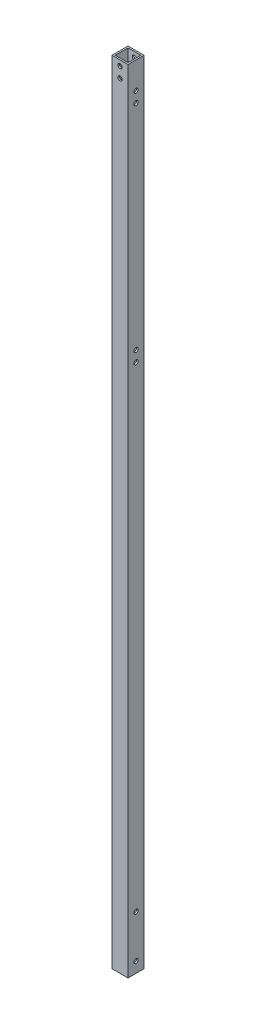
ISO-10303-21;
HEADER;
FILE_DESCRIPTION(('STEP AP214'),'2;1');
FILE_NAME('part.step','',(''),(''),'','','');
FILE_SCHEMA(('AUTOMOTIVE_DESIGN { 1 0 10303 214 1 1 1 1 }'));
ENDSEC;
DATA;
#1=APPLICATION_CONTEXT('core data for automotive mechanical design processes');
#2=APPLICATION_PROTOCOL_DEFINITION('international standard','automotive_design',2000,#1);
#3=PRODUCT_CONTEXT('',#1,'mechanical');
#4=PRODUCT('Part','Part','',(#3));
#5=PRODUCT_RELATED_PRODUCT_CATEGORY('part','',(#4));
#6=PRODUCT_DEFINITION_FORMATION('','',#4);
#7=PRODUCT_DEFINITION_CONTEXT('part definition',#1,'design');
#8=PRODUCT_DEFINITION('design','',#6,#7);
#9=PRODUCT_DEFINITION_SHAPE('','',#8);
#10=(LENGTH_UNIT() NAMED_UNIT(*) SI_UNIT(.MILLI.,.METRE.));
#11=(NAMED_UNIT(*) PLANE_ANGLE_UNIT() SI_UNIT($,.RADIAN.));
#12=(NAMED_UNIT(*) SI_UNIT($,.STERADIAN.) SOLID_ANGLE_UNIT());
#13=UNCERTAINTY_MEASURE_WITH_UNIT(LENGTH_MEASURE(1.E-05),#10,'distance_accuracy_value','');
#14=(GEOMETRIC_REPRESENTATION_CONTEXT(3) GLOBAL_UNCERTAINTY_ASSIGNED_CONTEXT((#13)) GLOBAL_UNIT_ASSIGNED_CONTEXT((#10,
#11,#12)) REPRESENTATION_CONTEXT('',''));
#15=CARTESIAN_POINT('',(0.,0.,0.));
#16=DIRECTION('',(0.,0.,1.));
#17=DIRECTION('',(1.,0.,0.));
#18=AXIS2_PLACEMENT_3D('',#15,#16,#17);
#19=CARTESIAN_POINT('',(0.,740.,0.));
#20=DIRECTION('',(0.,1.,0.));
#21=DIRECTION('',(0.,0.,1.));
#22=AXIS2_PLACEMENT_3D('',#19,#20,#21);
#23=PLANE('',#22);
#24=DIRECTION('',(0.,0.,-1.));
#25=VECTOR('',#24,1.);
#26=CARTESIAN_POINT('',(7.5,740.,-7.5));
#27=LINE('',#26,#25);
#28=CARTESIAN_POINT('',(7.5,740.,7.5));
#29=VERTEX_POINT('',#28);
#30=CARTESIAN_POINT('',(7.5,740.,-7.5));
#31=VERTEX_POINT('',#30);
#32=EDGE_CURVE('E181',#29,#31,#27,.T.);
#33=ORIENTED_EDGE('',*,*,#32,.T.);
#34=DIRECTION('',(-1.,0.,0.));
#35=VECTOR('',#34,1.);
#36=CARTESIAN_POINT('',(-7.5,740.,-7.5));
#37=LINE('',#36,#35);
#38=CARTESIAN_POINT('',(-7.5,740.,-7.5));
#39=VERTEX_POINT('',#38);
#40=EDGE_CURVE('E185',#31,#39,#37,.T.);
#41=ORIENTED_EDGE('',*,*,#40,.T.);
#42=DIRECTION('',(0.,0.,1.));
#43=VECTOR('',#42,1.);
#44=CARTESIAN_POINT('',(-7.5,740.,-7.5));
#45=LINE('',#44,#43);
#46=CARTESIAN_POINT('',(-7.5,740.,7.5));
#47=VERTEX_POINT('',#46);
#48=EDGE_CURVE('E189',#39,#47,#45,.T.);
#49=ORIENTED_EDGE('',*,*,#48,.T.);
#50=DIRECTION('',(1.,0.,0.));
#51=VECTOR('',#50,1.);
#52=CARTESIAN_POINT('',(-7.5,740.,7.5));
#53=LINE('',#52,#51);
#54=EDGE_CURVE('E192',#47,#29,#53,.T.);
#55=ORIENTED_EDGE('',*,*,#54,.T.);
#56=EDGE_LOOP('',(#33,#41,#49,#55));
#57=FACE_BOUND('',#56,.T.);
#58=DIRECTION('',(-1.,0.,0.));
#59=VECTOR('',#58,1.);
#60=CARTESIAN_POINT('',(-7.5,740.,-6.));
#61=LINE('',#60,#59);
#62=CARTESIAN_POINT('',(6.,740.,-6.));
#63=VERTEX_POINT('',#62);
#64=CARTESIAN_POINT('',(-6.,740.,-6.));
#65=VERTEX_POINT('',#64);
#66=EDGE_CURVE('E140',#63,#65,#61,.T.);
#67=ORIENTED_EDGE('',*,*,#66,.F.);
#68=DIRECTION('',(0.,0.,-1.));
#69=VECTOR('',#68,1.);
#70=CARTESIAN_POINT('',(6.,740.,-7.5));
#71=LINE('',#70,#69);
#72=CARTESIAN_POINT('',(6.,740.,6.));
#73=VERTEX_POINT('',#72);
#74=EDGE_CURVE('E131',#73,#63,#71,.T.);
#75=ORIENTED_EDGE('',*,*,#74,.F.);
#76=DIRECTION('',(1.,0.,0.));
#77=VECTOR('',#76,1.);
#78=CARTESIAN_POINT('',(-7.5,740.,6.));
#79=LINE('',#78,#77);
#80=CARTESIAN_POINT('',(-6.,740.,6.));
#81=VERTEX_POINT('',#80);
#82=EDGE_CURVE('E157',#81,#73,#79,.T.);
#83=ORIENTED_EDGE('',*,*,#82,.F.);
#84=DIRECTION('',(0.,0.,1.));
#85=VECTOR('',#84,1.);
#86=CARTESIAN_POINT('',(-6.,740.,-7.5));
#87=LINE('',#86,#85);
#88=EDGE_CURVE('E153',#65,#81,#87,.T.);
#89=ORIENTED_EDGE('',*,*,#88,.F.);
#90=EDGE_LOOP('',(#67,#75,#83,#89));
#91=FACE_BOUND('',#90,.T.);
#92=ADVANCED_FACE('F63',(#57,#91),#23,.T.);
#93=CARTESIAN_POINT('',(0.,0.,0.));
#94=DIRECTION('',(0.,1.,0.));
#95=DIRECTION('',(0.,0.,1.));
#96=AXIS2_PLACEMENT_3D('',#93,#94,#95);
#97=PLANE('',#96);
#98=DIRECTION('',(0.,0.,-1.));
#99=VECTOR('',#98,1.);
#100=CARTESIAN_POINT('',(7.5,0.,-7.5));
#101=LINE('',#100,#99);
#102=CARTESIAN_POINT('',(7.5,0.,7.5));
#103=VERTEX_POINT('',#102);
#104=CARTESIAN_POINT('',(7.5,0.,-7.5));
#105=VERTEX_POINT('',#104);
#106=EDGE_CURVE('E149',#103,#105,#101,.T.);
#107=ORIENTED_EDGE('',*,*,#106,.F.);
#108=DIRECTION('',(1.,0.,0.));
#109=VECTOR('',#108,1.);
#110=CARTESIAN_POINT('',(-7.5,0.,7.5));
#111=LINE('',#110,#109);
#112=CARTESIAN_POINT('',(-7.5,0.,7.5));
#113=VERTEX_POINT('',#112);
#114=EDGE_CURVE('E186',#113,#103,#111,.T.);
#115=ORIENTED_EDGE('',*,*,#114,.F.);
#116=DIRECTION('',(0.,0.,1.));
#117=VECTOR('',#116,1.);
#118=CARTESIAN_POINT('',(-7.5,0.,-7.5));
#119=LINE('',#118,#117);
#120=CARTESIAN_POINT('',(-7.5,0.,-7.5));
#121=VERTEX_POINT('',#120);
#122=EDGE_CURVE('E202',#121,#113,#119,.T.);
#123=ORIENTED_EDGE('',*,*,#122,.F.);
#124=DIRECTION('',(-1.,0.,0.));
#125=VECTOR('',#124,1.);
#126=CARTESIAN_POINT('',(-7.5,0.,-7.5));
#127=LINE('',#126,#125);
#128=EDGE_CURVE('E199',#105,#121,#127,.T.);
#129=ORIENTED_EDGE('',*,*,#128,.F.);
#130=EDGE_LOOP('',(#107,#115,#123,#129));
#131=FACE_BOUND('',#130,.T.);
#132=DIRECTION('',(0.,0.,-1.));
#133=VECTOR('',#132,1.);
#134=CARTESIAN_POINT('',(6.,0.,-7.5));
#135=LINE('',#134,#133);
#136=CARTESIAN_POINT('',(6.,0.,6.));
#137=VERTEX_POINT('',#136);
#138=CARTESIAN_POINT('',(6.,0.,-6.));
#139=VERTEX_POINT('',#138);
#140=EDGE_CURVE('E89',#137,#139,#135,.T.);
#141=ORIENTED_EDGE('',*,*,#140,.T.);
#142=DIRECTION('',(-1.,0.,0.));
#143=VECTOR('',#142,1.);
#144=CARTESIAN_POINT('',(-7.5,0.,-6.));
#145=LINE('',#144,#143);
#146=CARTESIAN_POINT('',(-6.,0.,-6.));
#147=VERTEX_POINT('',#146);
#148=EDGE_CURVE('E147',#139,#147,#145,.T.);
#149=ORIENTED_EDGE('',*,*,#148,.T.);
#150=DIRECTION('',(0.,0.,1.));
#151=VECTOR('',#150,1.);
#152=CARTESIAN_POINT('',(-6.,0.,-7.5));
#153=LINE('',#152,#151);
#154=CARTESIAN_POINT('',(-6.,0.,6.));
#155=VERTEX_POINT('',#154);
#156=EDGE_CURVE('E168',#147,#155,#153,.T.);
#157=ORIENTED_EDGE('',*,*,#156,.T.);
#158=DIRECTION('',(1.,0.,0.));
#159=VECTOR('',#158,1.);
#160=CARTESIAN_POINT('',(-7.5,0.,6.));
#161=LINE('',#160,#159);
#162=EDGE_CURVE('E141',#155,#137,#161,.T.);
#163=ORIENTED_EDGE('',*,*,#162,.T.);
#164=EDGE_LOOP('',(#141,#149,#157,#163));
#165=FACE_BOUND('',#164,.T.);
#166=ADVANCED_FACE('F372',(#131,#165),#97,.F.);
#167=CARTESIAN_POINT('',(7.5,740.,-7.5));
#168=DIRECTION('',(-1.,0.,0.));
#169=DIRECTION('',(0.,0.,1.));
#170=AXIS2_PLACEMENT_3D('',#167,#168,#169);
#171=PLANE('',#170);
#172=CARTESIAN_POINT('',(7.5,505.,0.));
#173=DIRECTION('',(1.,0.,0.));
#174=DIRECTION('',(0.,0.,-1.));
#175=AXIS2_PLACEMENT_3D('',#172,#173,#174);
#176=CIRCLE('',#175,2.);
#177=CARTESIAN_POINT('',(7.5,505.,-2.));
#178=VERTEX_POINT('',#177);
#179=EDGE_CURVE('E283',#178,#178,#176,.T.);
#180=ORIENTED_EDGE('',*,*,#179,.F.);
#181=EDGE_LOOP('',(#180));
#182=FACE_BOUND('',#181,.T.);
#183=CARTESIAN_POINT('',(7.5,705.,0.));
#184=DIRECTION('',(1.,0.,0.));
#185=DIRECTION('',(0.,0.,-1.));
#186=AXIS2_PLACEMENT_3D('',#183,#184,#185);
#187=CIRCLE('',#186,2.);
#188=CARTESIAN_POINT('',(7.5,705.,-2.00000000000001));
#189=VERTEX_POINT('',#188);
#190=EDGE_CURVE('E292',#189,#189,#187,.T.);
#191=ORIENTED_EDGE('',*,*,#190,.F.);
#192=EDGE_LOOP('',(#191));
#193=FACE_BOUND('',#192,.T.);
#194=CARTESIAN_POINT('',(7.5,715.,0.));
#195=DIRECTION('',(1.,0.,0.));
#196=DIRECTION('',(0.,0.,-1.));
#197=AXIS2_PLACEMENT_3D('',#194,#195,#196);
#198=CIRCLE('',#197,2.);
#199=CARTESIAN_POINT('',(7.5,715.,-2.));
#200=VERTEX_POINT('',#199);
#201=EDGE_CURVE('E291',#200,#200,#198,.T.);
#202=ORIENTED_EDGE('',*,*,#201,.F.);
#203=EDGE_LOOP('',(#202));
#204=FACE_BOUND('',#203,.T.);
#205=CARTESIAN_POINT('',(7.5,10.,0.));
#206=DIRECTION('',(1.,0.,0.));
#207=DIRECTION('',(0.,0.,-1.));
#208=AXIS2_PLACEMENT_3D('',#205,#206,#207);
#209=CIRCLE('',#208,2.);
#210=CARTESIAN_POINT('',(7.5,10.,-2.));
#211=VERTEX_POINT('',#210);
#212=EDGE_CURVE('E308',#211,#211,#209,.T.);
#213=ORIENTED_EDGE('',*,*,#212,.F.);
#214=EDGE_LOOP('',(#213));
#215=FACE_BOUND('',#214,.T.);
#216=CARTESIAN_POINT('',(7.5,495.,0.));
#217=DIRECTION('',(1.,0.,0.));
#218=DIRECTION('',(0.,0.,-1.));
#219=AXIS2_PLACEMENT_3D('',#216,#217,#218);
#220=CIRCLE('',#219,2.);
#221=CARTESIAN_POINT('',(7.5,495.,-2.));
#222=VERTEX_POINT('',#221);
#223=EDGE_CURVE('E278',#222,#222,#220,.T.);
#224=ORIENTED_EDGE('',*,*,#223,.F.);
#225=EDGE_LOOP('',(#224));
#226=FACE_BOUND('',#225,.T.);
#227=CARTESIAN_POINT('',(7.5,50.,0.));
#228=DIRECTION('',(1.,0.,0.));
#229=DIRECTION('',(0.,0.,-1.));
#230=AXIS2_PLACEMENT_3D('',#227,#228,#229);
#231=CIRCLE('',#230,2.);
#232=CARTESIAN_POINT('',(7.5,50.,-2.));
#233=VERTEX_POINT('',#232);
#234=EDGE_CURVE('E307',#233,#233,#231,.T.);
#235=ORIENTED_EDGE('',*,*,#234,.F.);
#236=EDGE_LOOP('',(#235));
#237=FACE_BOUND('',#236,.T.);
#238=ORIENTED_EDGE('',*,*,#106,.T.);
#239=DIRECTION('',(0.,-1.,0.));
#240=VECTOR('',#239,1.);
#241=CARTESIAN_POINT('',(7.5,740.,-7.5));
#242=LINE('',#241,#240);
#243=EDGE_CURVE('E12',#31,#105,#242,.T.);
#244=ORIENTED_EDGE('',*,*,#243,.F.);
#245=ORIENTED_EDGE('',*,*,#32,.F.);
#246=DIRECTION('',(0.,-1.,0.));
#247=VECTOR('',#246,1.);
#248=CARTESIAN_POINT('',(7.5,740.,7.5));
#249=LINE('',#248,#247);
#250=EDGE_CURVE('E195',#29,#103,#249,.T.);
#251=ORIENTED_EDGE('',*,*,#250,.T.);
#252=EDGE_LOOP('',(#238,#244,#245,#251));
#253=FACE_BOUND('',#252,.T.);
#254=ADVANCED_FACE('F65',(#182,#193,#204,#215,#226,#237,#253),#171,.F.);
#255=CARTESIAN_POINT('',(-7.5,740.,-7.5));
#256=DIRECTION('',(0.,0.,1.));
#257=DIRECTION('',(1.,0.,0.));
#258=AXIS2_PLACEMENT_3D('',#255,#256,#257);
#259=PLANE('',#258);
#260=CARTESIAN_POINT('',(0.,735.,-7.5));
#261=DIRECTION('',(0.,0.,1.));
#262=DIRECTION('',(1.,0.,0.));
#263=AXIS2_PLACEMENT_3D('',#260,#261,#262);
#264=CIRCLE('',#263,2.);
#265=CARTESIAN_POINT('',(2.,735.,-7.5));
#266=VERTEX_POINT('',#265);
#267=EDGE_CURVE('E250',#266,#266,#264,.T.);
#268=ORIENTED_EDGE('',*,*,#267,.T.);
#269=EDGE_LOOP('',(#268));
#270=FACE_BOUND('',#269,.T.);
#271=CARTESIAN_POINT('',(0.,725.,-7.5));
#272=DIRECTION('',(0.,0.,1.));
#273=DIRECTION('',(1.,0.,0.));
#274=AXIS2_PLACEMENT_3D('',#271,#272,#273);
#275=CIRCLE('',#274,2.);
#276=CARTESIAN_POINT('',(2.,725.,-7.5));
#277=VERTEX_POINT('',#276);
#278=EDGE_CURVE('E264',#277,#277,#275,.T.);
#279=ORIENTED_EDGE('',*,*,#278,.T.);
#280=EDGE_LOOP('',(#279));
#281=FACE_BOUND('',#280,.T.);
#282=ORIENTED_EDGE('',*,*,#128,.T.);
#283=DIRECTION('',(0.,-1.,0.));
#284=VECTOR('',#283,1.);
#285=CARTESIAN_POINT('',(-7.5,740.,-7.5));
#286=LINE('',#285,#284);
#287=EDGE_CURVE('E73',#39,#121,#286,.T.);
#288=ORIENTED_EDGE('',*,*,#287,.F.);
#289=ORIENTED_EDGE('',*,*,#40,.F.);
#290=ORIENTED_EDGE('',*,*,#243,.T.);
#291=EDGE_LOOP('',(#282,#288,#289,#290));
#292=FACE_BOUND('',#291,.T.);
#293=ADVANCED_FACE('F371',(#270,#281,#292),#259,.F.);
#294=CARTESIAN_POINT('',(-7.5,740.,-7.5));
#295=DIRECTION('',(1.,0.,0.));
#296=DIRECTION('',(0.,0.,-1.));
#297=AXIS2_PLACEMENT_3D('',#294,#295,#296);
#298=PLANE('',#297);
#299=CARTESIAN_POINT('',(-7.50000000000001,505.,0.));
#300=DIRECTION('',(1.,0.,0.));
#301=DIRECTION('',(0.,0.,-1.));
#302=AXIS2_PLACEMENT_3D('',#299,#300,#301);
#303=CIRCLE('',#302,2.);
#304=CARTESIAN_POINT('',(-7.50000000000001,505.,-2.));
#305=VERTEX_POINT('',#304);
#306=EDGE_CURVE('E296',#305,#305,#303,.T.);
#307=ORIENTED_EDGE('',*,*,#306,.T.);
#308=EDGE_LOOP('',(#307));
#309=FACE_BOUND('',#308,.T.);
#310=CARTESIAN_POINT('',(-7.50000000000001,705.,0.));
#311=DIRECTION('',(1.,0.,0.));
#312=DIRECTION('',(0.,0.,-1.));
#313=AXIS2_PLACEMENT_3D('',#310,#311,#312);
#314=CIRCLE('',#313,2.);
#315=CARTESIAN_POINT('',(-7.50000000000001,705.,-2.));
#316=VERTEX_POINT('',#315);
#317=EDGE_CURVE('E287',#316,#316,#314,.T.);
#318=ORIENTED_EDGE('',*,*,#317,.T.);
#319=EDGE_LOOP('',(#318));
#320=FACE_BOUND('',#319,.T.);
#321=CARTESIAN_POINT('',(-7.50000000000001,715.,0.));
#322=DIRECTION('',(1.,0.,0.));
#323=DIRECTION('',(0.,0.,-1.));
#324=AXIS2_PLACEMENT_3D('',#321,#322,#323);
#325=CIRCLE('',#324,2.);
#326=CARTESIAN_POINT('',(-7.50000000000001,715.,-2.));
#327=VERTEX_POINT('',#326);
#328=EDGE_CURVE('E312',#327,#327,#325,.T.);
#329=ORIENTED_EDGE('',*,*,#328,.T.);
#330=EDGE_LOOP('',(#329));
#331=FACE_BOUND('',#330,.T.);
#332=CARTESIAN_POINT('',(-7.50000000000001,10.,0.));
#333=DIRECTION('',(1.,0.,0.));
#334=DIRECTION('',(0.,0.,-1.));
#335=AXIS2_PLACEMENT_3D('',#332,#333,#334);
#336=CIRCLE('',#335,2.);
#337=CARTESIAN_POINT('',(-7.50000000000001,10.,-2.));
#338=VERTEX_POINT('',#337);
#339=EDGE_CURVE('E303',#338,#338,#336,.T.);
#340=ORIENTED_EDGE('',*,*,#339,.T.);
#341=EDGE_LOOP('',(#340));
#342=FACE_BOUND('',#341,.T.);
#343=CARTESIAN_POINT('',(-7.50000000000001,495.,0.));
#344=DIRECTION('',(1.,0.,0.));
#345=DIRECTION('',(0.,0.,-1.));
#346=AXIS2_PLACEMENT_3D('',#343,#344,#345);
#347=CIRCLE('',#346,2.);
#348=CARTESIAN_POINT('',(-7.50000000000001,495.,-2.));
#349=VERTEX_POINT('',#348);
#350=EDGE_CURVE('E279',#349,#349,#347,.T.);
#351=ORIENTED_EDGE('',*,*,#350,.T.);
#352=EDGE_LOOP('',(#351));
#353=FACE_BOUND('',#352,.T.);
#354=CARTESIAN_POINT('',(-7.50000000000001,50.,0.));
#355=DIRECTION('',(1.,0.,0.));
#356=DIRECTION('',(0.,0.,-1.));
#357=AXIS2_PLACEMENT_3D('',#354,#355,#356);
#358=CIRCLE('',#357,2.);
#359=CARTESIAN_POINT('',(-7.50000000000001,50.,-2.));
#360=VERTEX_POINT('',#359);
#361=EDGE_CURVE('E222',#360,#360,#358,.T.);
#362=ORIENTED_EDGE('',*,*,#361,.T.);
#363=EDGE_LOOP('',(#362));
#364=FACE_BOUND('',#363,.T.);
#365=ORIENTED_EDGE('',*,*,#122,.T.);
#366=DIRECTION('',(0.,-1.,0.));
#367=VECTOR('',#366,1.);
#368=CARTESIAN_POINT('',(-7.5,740.,7.5));
#369=LINE('',#368,#367);
#370=EDGE_CURVE('E210',#47,#113,#369,.T.);
#371=ORIENTED_EDGE('',*,*,#370,.F.);
#372=ORIENTED_EDGE('',*,*,#48,.F.);
#373=ORIENTED_EDGE('',*,*,#287,.T.);
#374=EDGE_LOOP('',(#365,#371,#372,#373));
#375=FACE_BOUND('',#374,.T.);
#376=ADVANCED_FACE('F390',(#309,#320,#331,#342,#353,#364,#375),#298,.F.);
#377=CARTESIAN_POINT('',(-7.5,740.,7.5));
#378=DIRECTION('',(0.,0.,-1.));
#379=DIRECTION('',(-1.,0.,0.));
#380=AXIS2_PLACEMENT_3D('',#377,#378,#379);
#381=PLANE('',#380);
#382=CARTESIAN_POINT('',(0.,735.,7.5));
#383=DIRECTION('',(0.,0.,1.));
#384=DIRECTION('',(1.,0.,0.));
#385=AXIS2_PLACEMENT_3D('',#382,#383,#384);
#386=CIRCLE('',#385,2.);
#387=CARTESIAN_POINT('',(2.,735.,7.5));
#388=VERTEX_POINT('',#387);
#389=EDGE_CURVE('E258',#388,#388,#386,.T.);
#390=ORIENTED_EDGE('',*,*,#389,.F.);
#391=EDGE_LOOP('',(#390));
#392=FACE_BOUND('',#391,.T.);
#393=CARTESIAN_POINT('',(0.,725.,7.5));
#394=DIRECTION('',(0.,0.,1.));
#395=DIRECTION('',(1.,0.,0.));
#396=AXIS2_PLACEMENT_3D('',#393,#394,#395);
#397=CIRCLE('',#396,2.);
#398=CARTESIAN_POINT('',(2.,725.,7.5));
#399=VERTEX_POINT('',#398);
#400=EDGE_CURVE('E270',#399,#399,#397,.T.);
#401=ORIENTED_EDGE('',*,*,#400,.F.);
#402=EDGE_LOOP('',(#401));
#403=FACE_BOUND('',#402,.T.);
#404=ORIENTED_EDGE('',*,*,#114,.T.);
#405=ORIENTED_EDGE('',*,*,#250,.F.);
#406=ORIENTED_EDGE('',*,*,#54,.F.);
#407=ORIENTED_EDGE('',*,*,#370,.T.);
#408=EDGE_LOOP('',(#404,#405,#406,#407));
#409=FACE_BOUND('',#408,.T.);
#410=ADVANCED_FACE('F348',(#392,#403,#409),#381,.F.);
#411=CARTESIAN_POINT('',(6.,740.,-7.5));
#412=DIRECTION('',(-1.,0.,0.));
#413=DIRECTION('',(0.,0.,1.));
#414=AXIS2_PLACEMENT_3D('',#411,#412,#413);
#415=PLANE('',#414);
#416=CARTESIAN_POINT('',(6.,505.,0.));
#417=DIRECTION('',(-1.,0.,0.));
#418=DIRECTION('',(0.,0.,1.));
#419=AXIS2_PLACEMENT_3D('',#416,#417,#418);
#420=CIRCLE('',#419,2.);
#421=CARTESIAN_POINT('',(6.,505.,2.));
#422=VERTEX_POINT('',#421);
#423=EDGE_CURVE('E165',#422,#422,#420,.T.);
#424=ORIENTED_EDGE('',*,*,#423,.F.);
#425=EDGE_LOOP('',(#424));
#426=FACE_BOUND('',#425,.T.);
#427=CARTESIAN_POINT('',(6.,705.,0.));
#428=DIRECTION('',(-1.,0.,0.));
#429=DIRECTION('',(0.,0.,1.));
#430=AXIS2_PLACEMENT_3D('',#427,#428,#429);
#431=CIRCLE('',#430,2.);
#432=CARTESIAN_POINT('',(6.,705.,2.));
#433=VERTEX_POINT('',#432);
#434=EDGE_CURVE('E242',#433,#433,#431,.T.);
#435=ORIENTED_EDGE('',*,*,#434,.F.);
#436=EDGE_LOOP('',(#435));
#437=FACE_BOUND('',#436,.T.);
#438=CARTESIAN_POINT('',(6.,715.,0.));
#439=DIRECTION('',(-1.,0.,0.));
#440=DIRECTION('',(0.,0.,1.));
#441=AXIS2_PLACEMENT_3D('',#438,#439,#440);
#442=CIRCLE('',#441,2.);
#443=CARTESIAN_POINT('',(6.,715.,2.));
#444=VERTEX_POINT('',#443);
#445=EDGE_CURVE('E237',#444,#444,#442,.T.);
#446=ORIENTED_EDGE('',*,*,#445,.F.);
#447=EDGE_LOOP('',(#446));
#448=FACE_BOUND('',#447,.T.);
#449=CARTESIAN_POINT('',(6.,10.,0.));
#450=DIRECTION('',(-1.,0.,0.));
#451=DIRECTION('',(0.,0.,1.));
#452=AXIS2_PLACEMENT_3D('',#449,#450,#451);
#453=CIRCLE('',#452,2.);
#454=CARTESIAN_POINT('',(6.,10.,2.));
#455=VERTEX_POINT('',#454);
#456=EDGE_CURVE('E232',#455,#455,#453,.T.);
#457=ORIENTED_EDGE('',*,*,#456,.F.);
#458=EDGE_LOOP('',(#457));
#459=FACE_BOUND('',#458,.T.);
#460=CARTESIAN_POINT('',(6.,495.,0.));
#461=DIRECTION('',(-1.,0.,0.));
#462=DIRECTION('',(0.,0.,1.));
#463=AXIS2_PLACEMENT_3D('',#460,#461,#462);
#464=CIRCLE('',#463,2.);
#465=CARTESIAN_POINT('',(6.,495.,2.));
#466=VERTEX_POINT('',#465);
#467=EDGE_CURVE('E227',#466,#466,#464,.T.);
#468=ORIENTED_EDGE('',*,*,#467,.F.);
#469=EDGE_LOOP('',(#468));
#470=FACE_BOUND('',#469,.T.);
#471=CARTESIAN_POINT('',(6.,50.,0.));
#472=DIRECTION('',(-1.,0.,0.));
#473=DIRECTION('',(0.,0.,1.));
#474=AXIS2_PLACEMENT_3D('',#471,#472,#473);
#475=CIRCLE('',#474,2.);
#476=CARTESIAN_POINT('',(6.,50.,2.));
#477=VERTEX_POINT('',#476);
#478=EDGE_CURVE('E221',#477,#477,#475,.T.);
#479=ORIENTED_EDGE('',*,*,#478,.F.);
#480=EDGE_LOOP('',(#479));
#481=FACE_BOUND('',#480,.T.);
#482=ORIENTED_EDGE('',*,*,#140,.F.);
#483=DIRECTION('',(0.,-1.,0.));
#484=VECTOR('',#483,1.);
#485=CARTESIAN_POINT('',(6.,740.,6.));
#486=LINE('',#485,#484);
#487=EDGE_CURVE('E135',#73,#137,#486,.T.);
#488=ORIENTED_EDGE('',*,*,#487,.F.);
#489=ORIENTED_EDGE('',*,*,#74,.T.);
#490=DIRECTION('',(0.,-1.,0.));
#491=VECTOR('',#490,1.);
#492=CARTESIAN_POINT('',(6.,740.,-6.));
#493=LINE('',#492,#491);
#494=EDGE_CURVE('E134',#63,#139,#493,.T.);
#495=ORIENTED_EDGE('',*,*,#494,.T.);
#496=EDGE_LOOP('',(#482,#488,#489,#495));
#497=FACE_BOUND('',#496,.T.);
#498=ADVANCED_FACE('F133',(#426,#437,#448,#459,#470,#481,#497),#415,.T.);
#499=CARTESIAN_POINT('',(-7.5,740.,-6.));
#500=DIRECTION('',(0.,0.,1.));
#501=DIRECTION('',(1.,0.,0.));
#502=AXIS2_PLACEMENT_3D('',#499,#500,#501);
#503=PLANE('',#502);
#504=CARTESIAN_POINT('',(0.,735.,-6.));
#505=DIRECTION('',(0.,0.,1.));
#506=DIRECTION('',(1.,0.,0.));
#507=AXIS2_PLACEMENT_3D('',#504,#505,#506);
#508=CIRCLE('',#507,2.);
#509=CARTESIAN_POINT('',(2.,735.,-6.));
#510=VERTEX_POINT('',#509);
#511=EDGE_CURVE('E274',#510,#510,#508,.T.);
#512=ORIENTED_EDGE('',*,*,#511,.F.);
#513=EDGE_LOOP('',(#512));
#514=FACE_BOUND('',#513,.T.);
#515=CARTESIAN_POINT('',(0.,725.,-6.));
#516=DIRECTION('',(0.,0.,1.));
#517=DIRECTION('',(1.,0.,0.));
#518=AXIS2_PLACEMENT_3D('',#515,#516,#517);
#519=CIRCLE('',#518,2.);
#520=CARTESIAN_POINT('',(2.,725.,-6.));
#521=VERTEX_POINT('',#520);
#522=EDGE_CURVE('E249',#521,#521,#519,.T.);
#523=ORIENTED_EDGE('',*,*,#522,.F.);
#524=EDGE_LOOP('',(#523));
#525=FACE_BOUND('',#524,.T.);
#526=ORIENTED_EDGE('',*,*,#148,.F.);
#527=ORIENTED_EDGE('',*,*,#494,.F.);
#528=ORIENTED_EDGE('',*,*,#66,.T.);
#529=DIRECTION('',(0.,-1.,0.));
#530=VECTOR('',#529,1.);
#531=CARTESIAN_POINT('',(-6.,740.,-6.));
#532=LINE('',#531,#530);
#533=EDGE_CURVE('E150',#65,#147,#532,.T.);
#534=ORIENTED_EDGE('',*,*,#533,.T.);
#535=EDGE_LOOP('',(#526,#527,#528,#534));
#536=FACE_BOUND('',#535,.T.);
#537=ADVANCED_FACE('F144',(#514,#525,#536),#503,.T.);
#538=CARTESIAN_POINT('',(-6.,740.,-7.5));
#539=DIRECTION('',(1.,0.,0.));
#540=DIRECTION('',(0.,0.,-1.));
#541=AXIS2_PLACEMENT_3D('',#538,#539,#540);
#542=PLANE('',#541);
#543=CARTESIAN_POINT('',(-6.,505.,0.));
#544=DIRECTION('',(1.,0.,0.));
#545=DIRECTION('',(0.,0.,-1.));
#546=AXIS2_PLACEMENT_3D('',#543,#544,#545);
#547=CIRCLE('',#546,2.);
#548=CARTESIAN_POINT('',(-6.,505.,-2.));
#549=VERTEX_POINT('',#548);
#550=EDGE_CURVE('E243',#549,#549,#547,.T.);
#551=ORIENTED_EDGE('',*,*,#550,.F.);
#552=EDGE_LOOP('',(#551));
#553=FACE_BOUND('',#552,.T.);
#554=CARTESIAN_POINT('',(-6.,705.,0.));
#555=DIRECTION('',(1.,0.,0.));
#556=DIRECTION('',(0.,0.,-1.));
#557=AXIS2_PLACEMENT_3D('',#554,#555,#556);
#558=CIRCLE('',#557,2.);
#559=CARTESIAN_POINT('',(-6.,705.,-2.));
#560=VERTEX_POINT('',#559);
#561=EDGE_CURVE('E238',#560,#560,#558,.T.);
#562=ORIENTED_EDGE('',*,*,#561,.F.);
#563=EDGE_LOOP('',(#562));
#564=FACE_BOUND('',#563,.T.);
#565=CARTESIAN_POINT('',(-6.,715.,0.));
#566=DIRECTION('',(1.,0.,0.));
#567=DIRECTION('',(0.,0.,-1.));
#568=AXIS2_PLACEMENT_3D('',#565,#566,#567);
#569=CIRCLE('',#568,2.);
#570=CARTESIAN_POINT('',(-6.,715.,-2.));
#571=VERTEX_POINT('',#570);
#572=EDGE_CURVE('E233',#571,#571,#569,.T.);
#573=ORIENTED_EDGE('',*,*,#572,.F.);
#574=EDGE_LOOP('',(#573));
#575=FACE_BOUND('',#574,.T.);
#576=CARTESIAN_POINT('',(-6.,10.,0.));
#577=DIRECTION('',(1.,0.,0.));
#578=DIRECTION('',(0.,0.,-1.));
#579=AXIS2_PLACEMENT_3D('',#576,#577,#578);
#580=CIRCLE('',#579,2.);
#581=CARTESIAN_POINT('',(-6.,10.,-2.));
#582=VERTEX_POINT('',#581);
#583=EDGE_CURVE('E228',#582,#582,#580,.T.);
#584=ORIENTED_EDGE('',*,*,#583,.F.);
#585=EDGE_LOOP('',(#584));
#586=FACE_BOUND('',#585,.T.);
#587=CARTESIAN_POINT('',(-6.,495.,0.));
#588=DIRECTION('',(1.,0.,0.));
#589=DIRECTION('',(0.,0.,-1.));
#590=AXIS2_PLACEMENT_3D('',#587,#588,#589);
#591=CIRCLE('',#590,2.);
#592=CARTESIAN_POINT('',(-6.,495.,-2.));
#593=VERTEX_POINT('',#592);
#594=EDGE_CURVE('E223',#593,#593,#591,.T.);
#595=ORIENTED_EDGE('',*,*,#594,.F.);
#596=EDGE_LOOP('',(#595));
#597=FACE_BOUND('',#596,.T.);
#598=CARTESIAN_POINT('',(-6.,50.,0.));
#599=DIRECTION('',(1.,0.,0.));
#600=DIRECTION('',(0.,0.,-1.));
#601=AXIS2_PLACEMENT_3D('',#598,#599,#600);
#602=CIRCLE('',#601,2.);
#603=CARTESIAN_POINT('',(-6.,50.,-2.));
#604=VERTEX_POINT('',#603);
#605=EDGE_CURVE('E217',#604,#604,#602,.T.);
#606=ORIENTED_EDGE('',*,*,#605,.F.);
#607=EDGE_LOOP('',(#606));
#608=FACE_BOUND('',#607,.T.);
#609=ORIENTED_EDGE('',*,*,#156,.F.);
#610=ORIENTED_EDGE('',*,*,#533,.F.);
#611=ORIENTED_EDGE('',*,*,#88,.T.);
#612=DIRECTION('',(0.,-1.,0.));
#613=VECTOR('',#612,1.);
#614=CARTESIAN_POINT('',(-6.,740.,6.));
#615=LINE('',#614,#613);
#616=EDGE_CURVE('E81',#81,#155,#615,.T.);
#617=ORIENTED_EDGE('',*,*,#616,.T.);
#618=EDGE_LOOP('',(#609,#610,#611,#617));
#619=FACE_BOUND('',#618,.T.);
#620=ADVANCED_FACE('F410',(#553,#564,#575,#586,#597,#608,#619),#542,.T.);
#621=CARTESIAN_POINT('',(-7.5,740.,6.));
#622=DIRECTION('',(0.,0.,-1.));
#623=DIRECTION('',(-1.,0.,0.));
#624=AXIS2_PLACEMENT_3D('',#621,#622,#623);
#625=PLANE('',#624);
#626=CARTESIAN_POINT('',(0.,735.,6.));
#627=DIRECTION('',(0.,0.,-1.));
#628=DIRECTION('',(-1.,0.,0.));
#629=AXIS2_PLACEMENT_3D('',#626,#627,#628);
#630=CIRCLE('',#629,2.);
#631=CARTESIAN_POINT('',(-2.,735.,6.));
#632=VERTEX_POINT('',#631);
#633=EDGE_CURVE('E67',#632,#632,#630,.T.);
#634=ORIENTED_EDGE('',*,*,#633,.F.);
#635=EDGE_LOOP('',(#634));
#636=FACE_BOUND('',#635,.T.);
#637=CARTESIAN_POINT('',(0.,725.,6.));
#638=DIRECTION('',(0.,0.,-1.));
#639=DIRECTION('',(-1.,0.,0.));
#640=AXIS2_PLACEMENT_3D('',#637,#638,#639);
#641=CIRCLE('',#640,2.);
#642=CARTESIAN_POINT('',(-2.,725.,6.));
#643=VERTEX_POINT('',#642);
#644=EDGE_CURVE('E246',#643,#643,#641,.T.);
#645=ORIENTED_EDGE('',*,*,#644,.F.);
#646=EDGE_LOOP('',(#645));
#647=FACE_BOUND('',#646,.T.);
#648=ORIENTED_EDGE('',*,*,#162,.F.);
#649=ORIENTED_EDGE('',*,*,#616,.F.);
#650=ORIENTED_EDGE('',*,*,#82,.T.);
#651=ORIENTED_EDGE('',*,*,#487,.T.);
#652=EDGE_LOOP('',(#648,#649,#650,#651));
#653=FACE_BOUND('',#652,.T.);
#654=ADVANCED_FACE('F414',(#636,#647,#653),#625,.T.);
#655=CARTESIAN_POINT('',(-7.50000000000001,50.,0.));
#656=DIRECTION('',(1.,0.,0.));
#657=DIRECTION('',(0.,0.,-1.));
#658=AXIS2_PLACEMENT_3D('',#655,#656,#657);
#659=CYLINDRICAL_SURFACE('',#658,2.);
#660=ORIENTED_EDGE('',*,*,#605,.T.);
#661=EDGE_LOOP('',(#660));
#662=FACE_BOUND('',#661,.T.);
#663=ORIENTED_EDGE('',*,*,#361,.F.);
#664=EDGE_LOOP('',(#663));
#665=FACE_BOUND('',#664,.T.);
#666=ADVANCED_FACE('F366',(#662,#665),#659,.F.);
#667=CARTESIAN_POINT('',(-7.50000000000001,495.,0.));
#668=DIRECTION('',(1.,0.,0.));
#669=DIRECTION('',(0.,0.,-1.));
#670=AXIS2_PLACEMENT_3D('',#667,#668,#669);
#671=CYLINDRICAL_SURFACE('',#670,2.);
#672=ORIENTED_EDGE('',*,*,#594,.T.);
#673=EDGE_LOOP('',(#672));
#674=FACE_BOUND('',#673,.T.);
#675=ORIENTED_EDGE('',*,*,#350,.F.);
#676=EDGE_LOOP('',(#675));
#677=FACE_BOUND('',#676,.T.);
#678=ADVANCED_FACE('F420',(#674,#677),#671,.F.);
#679=CARTESIAN_POINT('',(-7.50000000000001,10.,0.));
#680=DIRECTION('',(1.,0.,0.));
#681=DIRECTION('',(0.,0.,-1.));
#682=AXIS2_PLACEMENT_3D('',#679,#680,#681);
#683=CYLINDRICAL_SURFACE('',#682,2.);
#684=ORIENTED_EDGE('',*,*,#583,.T.);
#685=EDGE_LOOP('',(#684));
#686=FACE_BOUND('',#685,.T.);
#687=ORIENTED_EDGE('',*,*,#339,.F.);
#688=EDGE_LOOP('',(#687));
#689=FACE_BOUND('',#688,.T.);
#690=ADVANCED_FACE('F426',(#686,#689),#683,.F.);
#691=CARTESIAN_POINT('',(-7.50000000000001,715.,0.));
#692=DIRECTION('',(1.,0.,0.));
#693=DIRECTION('',(0.,0.,-1.));
#694=AXIS2_PLACEMENT_3D('',#691,#692,#693);
#695=CYLINDRICAL_SURFACE('',#694,2.);
#696=ORIENTED_EDGE('',*,*,#572,.T.);
#697=EDGE_LOOP('',(#696));
#698=FACE_BOUND('',#697,.T.);
#699=ORIENTED_EDGE('',*,*,#328,.F.);
#700=EDGE_LOOP('',(#699));
#701=FACE_BOUND('',#700,.T.);
#702=ADVANCED_FACE('F422',(#698,#701),#695,.F.);
#703=CARTESIAN_POINT('',(-7.50000000000001,705.,0.));
#704=DIRECTION('',(1.,0.,0.));
#705=DIRECTION('',(0.,0.,-1.));
#706=AXIS2_PLACEMENT_3D('',#703,#704,#705);
#707=CYLINDRICAL_SURFACE('',#706,2.);
#708=ORIENTED_EDGE('',*,*,#561,.T.);
#709=EDGE_LOOP('',(#708));
#710=FACE_BOUND('',#709,.T.);
#711=ORIENTED_EDGE('',*,*,#317,.F.);
#712=EDGE_LOOP('',(#711));
#713=FACE_BOUND('',#712,.T.);
#714=ADVANCED_FACE('F425',(#710,#713),#707,.F.);
#715=CARTESIAN_POINT('',(-7.50000000000001,505.,0.));
#716=DIRECTION('',(1.,0.,0.));
#717=DIRECTION('',(0.,0.,-1.));
#718=AXIS2_PLACEMENT_3D('',#715,#716,#717);
#719=CYLINDRICAL_SURFACE('',#718,2.);
#720=ORIENTED_EDGE('',*,*,#550,.T.);
#721=EDGE_LOOP('',(#720));
#722=FACE_BOUND('',#721,.T.);
#723=ORIENTED_EDGE('',*,*,#306,.F.);
#724=EDGE_LOOP('',(#723));
#725=FACE_BOUND('',#724,.T.);
#726=ADVANCED_FACE('F364',(#722,#725),#719,.F.);
#727=ORIENTED_EDGE('',*,*,#478,.T.);
#728=EDGE_LOOP('',(#727));
#729=FACE_BOUND('',#728,.T.);
#730=ORIENTED_EDGE('',*,*,#234,.T.);
#731=EDGE_LOOP('',(#730));
#732=FACE_BOUND('',#731,.T.);
#733=ADVANCED_FACE('F360',(#729,#732),#659,.F.);
#734=ORIENTED_EDGE('',*,*,#467,.T.);
#735=EDGE_LOOP('',(#734));
#736=FACE_BOUND('',#735,.T.);
#737=ORIENTED_EDGE('',*,*,#223,.T.);
#738=EDGE_LOOP('',(#737));
#739=FACE_BOUND('',#738,.T.);
#740=ADVANCED_FACE('F363',(#736,#739),#671,.F.);
#741=ORIENTED_EDGE('',*,*,#456,.T.);
#742=EDGE_LOOP('',(#741));
#743=FACE_BOUND('',#742,.T.);
#744=ORIENTED_EDGE('',*,*,#212,.T.);
#745=EDGE_LOOP('',(#744));
#746=FACE_BOUND('',#745,.T.);
#747=ADVANCED_FACE('F432',(#743,#746),#683,.F.);
#748=ORIENTED_EDGE('',*,*,#445,.T.);
#749=EDGE_LOOP('',(#748));
#750=FACE_BOUND('',#749,.T.);
#751=ORIENTED_EDGE('',*,*,#201,.T.);
#752=EDGE_LOOP('',(#751));
#753=FACE_BOUND('',#752,.T.);
#754=ADVANCED_FACE('F428',(#750,#753),#695,.F.);
#755=ORIENTED_EDGE('',*,*,#434,.T.);
#756=EDGE_LOOP('',(#755));
#757=FACE_BOUND('',#756,.T.);
#758=ORIENTED_EDGE('',*,*,#190,.T.);
#759=EDGE_LOOP('',(#758));
#760=FACE_BOUND('',#759,.T.);
#761=ADVANCED_FACE('F439',(#757,#760),#707,.F.);
#762=ORIENTED_EDGE('',*,*,#423,.T.);
#763=EDGE_LOOP('',(#762));
#764=FACE_BOUND('',#763,.T.);
#765=ORIENTED_EDGE('',*,*,#179,.T.);
#766=EDGE_LOOP('',(#765));
#767=FACE_BOUND('',#766,.T.);
#768=ADVANCED_FACE('F343',(#764,#767),#719,.F.);
#769=CARTESIAN_POINT('',(0.,725.,-7.5));
#770=DIRECTION('',(0.,0.,1.));
#771=DIRECTION('',(1.,0.,0.));
#772=AXIS2_PLACEMENT_3D('',#769,#770,#771);
#773=CYLINDRICAL_SURFACE('',#772,2.);
#774=ORIENTED_EDGE('',*,*,#644,.T.);
#775=EDGE_LOOP('',(#774));
#776=FACE_BOUND('',#775,.T.);
#777=ORIENTED_EDGE('',*,*,#400,.T.);
#778=EDGE_LOOP('',(#777));
#779=FACE_BOUND('',#778,.T.);
#780=ADVANCED_FACE('F443',(#776,#779),#773,.F.);
#781=CARTESIAN_POINT('',(0.,735.,-7.5));
#782=DIRECTION('',(0.,0.,1.));
#783=DIRECTION('',(1.,0.,0.));
#784=AXIS2_PLACEMENT_3D('',#781,#782,#783);
#785=CYLINDRICAL_SURFACE('',#784,2.);
#786=ORIENTED_EDGE('',*,*,#633,.T.);
#787=EDGE_LOOP('',(#786));
#788=FACE_BOUND('',#787,.T.);
#789=ORIENTED_EDGE('',*,*,#389,.T.);
#790=EDGE_LOOP('',(#789));
#791=FACE_BOUND('',#790,.T.);
#792=ADVANCED_FACE('F446',(#788,#791),#785,.F.);
#793=ORIENTED_EDGE('',*,*,#522,.T.);
#794=EDGE_LOOP('',(#793));
#795=FACE_BOUND('',#794,.T.);
#796=ORIENTED_EDGE('',*,*,#278,.F.);
#797=EDGE_LOOP('',(#796));
#798=FACE_BOUND('',#797,.T.);
#799=ADVANCED_FACE('F447',(#795,#798),#773,.F.);
#800=ORIENTED_EDGE('',*,*,#511,.T.);
#801=EDGE_LOOP('',(#800));
#802=FACE_BOUND('',#801,.T.);
#803=ORIENTED_EDGE('',*,*,#267,.F.);
#804=EDGE_LOOP('',(#803));
#805=FACE_BOUND('',#804,.T.);
#806=ADVANCED_FACE('F450',(#802,#805),#785,.F.);
#807=CLOSED_SHELL('',(#92,#166,#254,#293,#376,#410,#498,#537,#620,#654,#666,#678,#690,#702,#714,
#726,#733,#740,#747,#754,#761,#768,#780,#792,#799,#806));
#808=MANIFOLD_SOLID_BREP('B2',#807);
#809=ADVANCED_BREP_SHAPE_REPRESENTATION('',(#18,#808),#14);
#810=SHAPE_DEFINITION_REPRESENTATION(#9,#809);
ENDSEC;
END-ISO-10303-21;
